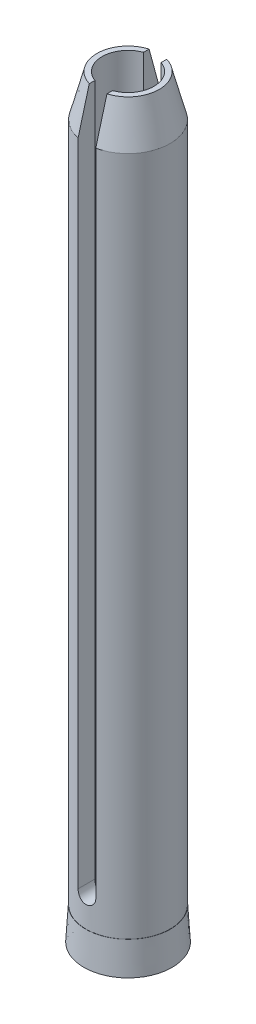
ISO-10303-21;
HEADER;
FILE_DESCRIPTION(('STEP AP214'),'2;1');
FILE_NAME('part.step','',(''),(''),'','','');
FILE_SCHEMA(('AUTOMOTIVE_DESIGN { 1 0 10303 214 1 1 1 1 }'));
ENDSEC;
DATA;
#1=APPLICATION_CONTEXT('core data for automotive mechanical design processes');
#2=APPLICATION_PROTOCOL_DEFINITION('international standard','automotive_design',2000,#1);
#3=PRODUCT_CONTEXT('',#1,'mechanical');
#4=PRODUCT('Part','Part','',(#3));
#5=PRODUCT_RELATED_PRODUCT_CATEGORY('part','',(#4));
#6=PRODUCT_DEFINITION_FORMATION('','',#4);
#7=PRODUCT_DEFINITION_CONTEXT('part definition',#1,'design');
#8=PRODUCT_DEFINITION('design','',#6,#7);
#9=PRODUCT_DEFINITION_SHAPE('','',#8);
#10=(LENGTH_UNIT() NAMED_UNIT(*) SI_UNIT(.MILLI.,.METRE.));
#11=(NAMED_UNIT(*) PLANE_ANGLE_UNIT() SI_UNIT($,.RADIAN.));
#12=(NAMED_UNIT(*) SI_UNIT($,.STERADIAN.) SOLID_ANGLE_UNIT());
#13=UNCERTAINTY_MEASURE_WITH_UNIT(LENGTH_MEASURE(1.E-05),#10,'distance_accuracy_value','');
#14=(GEOMETRIC_REPRESENTATION_CONTEXT(3) GLOBAL_UNCERTAINTY_ASSIGNED_CONTEXT((#13)) GLOBAL_UNIT_ASSIGNED_CONTEXT((#10,
#11,#12)) REPRESENTATION_CONTEXT('',''));
#15=CARTESIAN_POINT('',(0.,0.,0.));
#16=DIRECTION('',(0.,0.,1.));
#17=DIRECTION('',(1.,0.,0.));
#18=AXIS2_PLACEMENT_3D('',#15,#16,#17);
#19=CARTESIAN_POINT('',(0.,140.8,0.));
#20=DIRECTION('',(0.,1.,0.));
#21=DIRECTION('',(0.,0.,1.));
#22=AXIS2_PLACEMENT_3D('',#19,#20,#21);
#23=PLANE('',#22);
#24=DIRECTION('',(0.,0.,1.));
#25=VECTOR('',#24,1.);
#26=CARTESIAN_POINT('',(-1.65,140.8,-8.24));
#27=LINE('',#26,#25);
#28=CARTESIAN_POINT('',(-1.65,140.8,-5.58459636896277));
#29=VERTEX_POINT('',#28);
#30=CARTESIAN_POINT('',(-1.65,140.8,-4.54474696765397));
#31=VERTEX_POINT('',#30);
#32=EDGE_CURVE('E212',#29,#31,#27,.T.);
#33=ORIENTED_EDGE('',*,*,#32,.F.);
#34=CARTESIAN_POINT('',(0.,140.8,0.));
#35=DIRECTION('',(0.,1.,0.));
#36=DIRECTION('',(-1.,0.,0.));
#37=AXIS2_PLACEMENT_3D('',#34,#35,#36);
#38=CIRCLE('',#37,5.82324794287794);
#39=CARTESIAN_POINT('',(-1.65,140.8,5.58459636896277));
#40=VERTEX_POINT('',#39);
#41=EDGE_CURVE('E60',#29,#40,#38,.T.);
#42=ORIENTED_EDGE('',*,*,#41,.T.);
#43=CARTESIAN_POINT('',(-1.65,140.8,4.54474696765397));
#44=VERTEX_POINT('',#43);
#45=EDGE_CURVE('E135',#44,#40,#27,.T.);
#46=ORIENTED_EDGE('',*,*,#45,.F.);
#47=CARTESIAN_POINT('',(0.,140.8,0.));
#48=DIRECTION('',(0.,1.,0.));
#49=DIRECTION('',(0.,0.,1.));
#50=AXIS2_PLACEMENT_3D('',#47,#48,#49);
#51=CIRCLE('',#50,4.835);
#52=EDGE_CURVE('E204',#31,#44,#51,.T.);
#53=ORIENTED_EDGE('',*,*,#52,.F.);
#54=EDGE_LOOP('',(#33,#42,#46,#53));
#55=FACE_BOUND('',#54,.T.);
#56=ADVANCED_FACE('F39',(#55),#23,.T.);
#57=CARTESIAN_POINT('',(0.,140.8,0.));
#58=DIRECTION('',(0.,-1.,0.));
#59=DIRECTION('',(0.,0.,-1.));
#60=AXIS2_PLACEMENT_3D('',#57,#58,#59);
#61=CYLINDRICAL_SURFACE('',#60,7.85);
#62=CARTESIAN_POINT('',(0.,6.,0.));
#63=DIRECTION('',(0.,1.,0.));
#64=DIRECTION('',(0.,0.,1.));
#65=AXIS2_PLACEMENT_3D('',#62,#63,#64);
#66=CIRCLE('',#65,7.85);
#67=CARTESIAN_POINT('',(0.,6.,7.85));
#68=VERTEX_POINT('',#67);
#69=EDGE_CURVE('E218',#68,#68,#66,.T.);
#70=ORIENTED_EDGE('',*,*,#69,.T.);
#71=EDGE_LOOP('',(#70));
#72=FACE_BOUND('',#71,.T.);
#73=CARTESIAN_POINT('',(0.,133.06,0.));
#74=DIRECTION('',(0.,1.,0.));
#75=DIRECTION('',(-1.,0.,0.));
#76=AXIS2_PLACEMENT_3D('',#73,#74,#75);
#77=CIRCLE('',#76,7.85);
#78=CARTESIAN_POINT('',(1.65,133.06,7.67463354173996));
#79=VERTEX_POINT('',#78);
#80=CARTESIAN_POINT('',(1.65,133.06,-7.67463354173996));
#81=VERTEX_POINT('',#80);
#82=EDGE_CURVE('E67',#79,#81,#77,.T.);
#83=ORIENTED_EDGE('',*,*,#82,.F.);
#84=DIRECTION('',(0.,-1.,0.));
#85=VECTOR('',#84,1.);
#86=CARTESIAN_POINT('',(1.65,140.8,7.67463354173996));
#87=LINE('',#86,#85);
#88=CARTESIAN_POINT('',(1.65,11.6214187123484,7.67463354173996));
#89=VERTEX_POINT('',#88);
#90=EDGE_CURVE('E144',#79,#89,#87,.T.);
#91=ORIENTED_EDGE('',*,*,#90,.T.);
#92=CARTESIAN_POINT('',(1.65,11.6214187123484,7.67463354173996));
#93=CARTESIAN_POINT('',(1.65003972735565,11.5755474602447,7.67462256804998));
#94=CARTESIAN_POINT('',(1.64816473167229,11.5296969742745,7.67502837586591));
#95=CARTESIAN_POINT('',(1.64060989678428,11.4383309244032,7.67664780128677));
#96=CARTESIAN_POINT('',(1.63493055826137,11.3928153172264,7.67786131259137));
#97=CARTESIAN_POINT('',(1.61225990352662,11.2574179408737,7.68266695033582));
#98=CARTESIAN_POINT('',(1.58963585647476,11.1684541716994,7.68742439172302));
#99=CARTESIAN_POINT('',(1.53006821836619,10.9956964387333,7.69950013800612));
#100=CARTESIAN_POINT('',(1.49312356804851,10.9119028578997,7.70681863233312));
#101=CARTESIAN_POINT('',(1.40599647770422,10.7516748760457,7.72318794441513));
#102=CARTESIAN_POINT('',(1.35581226198781,10.675241464049,7.73223899449571));
#103=CARTESIAN_POINT('',(1.24280770698675,10.5307528865059,7.75120941406419));
#104=CARTESIAN_POINT('',(1.17982174284139,10.4628286463033,7.76113908681371));
#105=CARTESIAN_POINT('',(1.04335128757635,10.3384208998016,7.78065944728201));
#106=CARTESIAN_POINT('',(0.969865159278708,10.2819391809388,7.79025008184678));
#107=CARTESIAN_POINT('',(0.813598859904362,10.1815057330754,7.80812343851194));
#108=CARTESIAN_POINT('',(0.730735296962562,10.1376811260242,7.81639254223732));
#109=CARTESIAN_POINT('',(0.55862211016667,10.0646292721721,7.83057385648564));
#110=CARTESIAN_POINT('',(0.469373489138078,10.0353997388247,7.8364864361656));
#111=CARTESIAN_POINT('',(0.288387824078499,9.99277837338936,7.84521626552949));
#112=CARTESIAN_POINT('',(0.19670536448066,9.97916381520481,7.84807700319909));
#113=CARTESIAN_POINT('',(0.012313883362104,9.96746238723226,7.85053156427416));
#114=CARTESIAN_POINT('',(-0.0803950520734757,9.96937422503072,7.8501256595942));
#115=CARTESIAN_POINT('',(-0.262660812335773,9.98850530497952,7.84612595019233));
#116=CARTESIAN_POINT('',(-0.352244289385008,10.0054827080864,7.84258251248012));
#117=CARTESIAN_POINT('',(-0.527260787014152,10.0538772444349,7.83276344292941));
#118=CARTESIAN_POINT('',(-0.612693663759819,10.085294877692,7.82648771648159));
#119=CARTESIAN_POINT('',(-0.777658532168961,10.1618934152309,7.81182808746722));
#120=CARTESIAN_POINT('',(-0.857146388956486,10.2071665673403,7.80343012275681));
#121=CARTESIAN_POINT('',(-1.00748272903928,10.310121611721,7.78544919096319));
#122=CARTESIAN_POINT('',(-1.07833037291991,10.3678047081418,7.77586610892523));
#123=CARTESIAN_POINT('',(-1.21080463022692,10.4952505703939,7.75635404299457));
#124=CARTESIAN_POINT('',(-1.27222893794057,10.5652232944036,7.74642194896));
#125=CARTESIAN_POINT('',(-1.38252284484199,10.7145991021547,7.72750105000793));
#126=CARTESIAN_POINT('',(-1.43138904068379,10.79400473378,7.7185125011881));
#127=CARTESIAN_POINT('',(-1.51526584422294,10.9603204937112,7.70248698181739));
#128=CARTESIAN_POINT('',(-1.55023194870393,11.0472536577849,7.69545630084915));
#129=CARTESIAN_POINT('',(-1.60495324669829,11.2258895073466,7.68423180852507));
#130=CARTESIAN_POINT('',(-1.62473083550905,11.3175849569202,7.68003382150699));
#131=CARTESIAN_POINT('',(-1.64110408120381,11.4452593844934,7.67654154504414));
#132=CARTESIAN_POINT('',(-1.64446763666095,11.4804337271921,7.67582120686153));
#133=CARTESIAN_POINT('',(-1.64892799305678,11.5508732547371,7.67486429100913));
#134=CARTESIAN_POINT('',(-1.65002858197185,11.5861381886815,7.67462690493357));
#135=CARTESIAN_POINT('',(-1.65,11.6214187123484,7.67463354173996));
#136=B_SPLINE_CURVE_WITH_KNOTS('',3,(#92,#93,#94,#95,#96,#97,#98,#99,#100,#101,#102,#103,#104,
#105,#106,#107,#108,#109,#110,#111,#112,#113,#114,#115,#116,#117,#118,#119,#120,#121,#122,#123,
#124,#125,#126,#127,#128,#129,#130,#131,#132,#133,#134,#135),.UNSPECIFIED.,.F.,.F.,(4,2,2,2,2,2,
2,2,2,2,2,2,2,2,2,2,2,2,2,2,2,4),(0.,0.137527637235074,0.275037178295358,0.549370921269742,
0.823724959931889,1.09811581366607,1.37631286169738,1.65455333343926,1.93549818303898,
2.21639900441623,2.49324128643293,2.77006052439976,3.04251493873537,3.31497878793815,
3.58929764560211,3.86364313271821,4.14323639410386,4.42290534772218,4.70346262778498,
4.98360543075054,5.0895725174194,5.19536208105572),.UNSPECIFIED.);
#137=CARTESIAN_POINT('',(-1.65,11.6214187123484,7.67463354173996));
#138=VERTEX_POINT('',#137);
#139=EDGE_CURVE('E142',#89,#138,#136,.T.);
#140=ORIENTED_EDGE('',*,*,#139,.T.);
#141=DIRECTION('',(0.,-1.,0.));
#142=VECTOR('',#141,1.);
#143=CARTESIAN_POINT('',(-1.65,140.8,7.67463354173996));
#144=LINE('',#143,#142);
#145=CARTESIAN_POINT('',(-1.65,133.06,7.67463354173996));
#146=VERTEX_POINT('',#145);
#147=EDGE_CURVE('E132',#138,#146,#144,.F.);
#148=ORIENTED_EDGE('',*,*,#147,.T.);
#149=CARTESIAN_POINT('',(-1.65,133.06,-7.67463354173996));
#150=VERTEX_POINT('',#149);
#151=EDGE_CURVE('E119',#150,#146,#77,.T.);
#152=ORIENTED_EDGE('',*,*,#151,.F.);
#153=DIRECTION('',(0.,-1.,0.));
#154=VECTOR('',#153,1.);
#155=CARTESIAN_POINT('',(-1.65,140.8,-7.67463354173996));
#156=LINE('',#155,#154);
#157=CARTESIAN_POINT('',(-1.65,11.6214187123484,-7.67463354173996));
#158=VERTEX_POINT('',#157);
#159=EDGE_CURVE('E143',#150,#158,#156,.T.);
#160=ORIENTED_EDGE('',*,*,#159,.T.);
#161=CARTESIAN_POINT('',(-1.65,11.6214187123484,-7.67463354173996));
#162=CARTESIAN_POINT('',(-1.65003972735565,11.5755474602447,-7.67462256804998));
#163=CARTESIAN_POINT('',(-1.64816473167229,11.5296969742745,-7.67502837586591));
#164=CARTESIAN_POINT('',(-1.64060989678427,11.4383309244032,-7.67664780128677));
#165=CARTESIAN_POINT('',(-1.63493055826137,11.3928153172264,-7.67786131259137));
#166=CARTESIAN_POINT('',(-1.61225990352662,11.2574179408737,-7.68266695033582));
#167=CARTESIAN_POINT('',(-1.58963585647476,11.1684541716994,-7.68742439172302));
#168=CARTESIAN_POINT('',(-1.53006821836618,10.9956964387333,-7.69950013800612));
#169=CARTESIAN_POINT('',(-1.4931235680485,10.9119028578997,-7.70681863233312));
#170=CARTESIAN_POINT('',(-1.40599647770422,10.7516748760457,-7.72318794441513));
#171=CARTESIAN_POINT('',(-1.35581226198781,10.675241464049,-7.73223899449571));
#172=CARTESIAN_POINT('',(-1.24280770698675,10.5307528865059,-7.75120941406419));
#173=CARTESIAN_POINT('',(-1.17982174284139,10.4628286463033,-7.76113908681371));
#174=CARTESIAN_POINT('',(-1.04335128757635,10.3384208998016,-7.78065944728201));
#175=CARTESIAN_POINT('',(-0.969865159278705,10.2819391809388,-7.79025008184678));
#176=CARTESIAN_POINT('',(-0.813598859904359,10.1815057330754,-7.80812343851195));
#177=CARTESIAN_POINT('',(-0.730735296962558,10.1376811260242,-7.81639254223732));
#178=CARTESIAN_POINT('',(-0.558622110166667,10.0646292721721,-7.83057385648564));
#179=CARTESIAN_POINT('',(-0.469373489138074,10.0353997388247,-7.8364864361656));
#180=CARTESIAN_POINT('',(-0.288387824078496,9.99277837338936,-7.84521626552949));
#181=CARTESIAN_POINT('',(-0.196705364480657,9.97916381520481,-7.84807700319909));
#182=CARTESIAN_POINT('',(-0.0123138833621007,9.96746238723226,-7.85053156427416));
#183=CARTESIAN_POINT('',(0.080395052073479,9.96937422503072,-7.8501256595942));
#184=CARTESIAN_POINT('',(0.262660812335776,9.98850530497952,-7.84612595019233));
#185=CARTESIAN_POINT('',(0.352244289385011,10.0054827080864,-7.84258251248012));
#186=CARTESIAN_POINT('',(0.527260787014156,10.0538772444349,-7.83276344292941));
#187=CARTESIAN_POINT('',(0.612693663759822,10.085294877692,-7.82648771648159));
#188=CARTESIAN_POINT('',(0.777658532168964,10.1618934152309,-7.81182808746722));
#189=CARTESIAN_POINT('',(0.857146388956489,10.2071665673403,-7.8034301227568));
#190=CARTESIAN_POINT('',(1.00748272903928,10.310121611721,-7.78544919096319));
#191=CARTESIAN_POINT('',(1.07833037291992,10.3678047081418,-7.77586610892523));
#192=CARTESIAN_POINT('',(1.21080463022693,10.4952505703939,-7.75635404299457));
#193=CARTESIAN_POINT('',(1.27222893794057,10.5652232944036,-7.74642194896));
#194=CARTESIAN_POINT('',(1.38252284484199,10.7145991021547,-7.72750105000793));
#195=CARTESIAN_POINT('',(1.4313890406838,10.79400473378,-7.7185125011881));
#196=CARTESIAN_POINT('',(1.51526584422294,10.9603204937112,-7.70248698181739));
#197=CARTESIAN_POINT('',(1.55023194870394,11.0472536577849,-7.69545630084915));
#198=CARTESIAN_POINT('',(1.60495324669829,11.2258895073466,-7.68423180852507));
#199=CARTESIAN_POINT('',(1.62473083550906,11.3175849569202,-7.68003382150699));
#200=CARTESIAN_POINT('',(1.64110408120382,11.4452593844934,-7.67654154504414));
#201=CARTESIAN_POINT('',(1.64446763666095,11.4804337271921,-7.67582120686153));
#202=CARTESIAN_POINT('',(1.64892799305678,11.5508732547371,-7.67486429100913));
#203=CARTESIAN_POINT('',(1.65002858197185,11.5861381886815,-7.67462690493357));
#204=CARTESIAN_POINT('',(1.65,11.6214187123484,-7.67463354173996));
#205=B_SPLINE_CURVE_WITH_KNOTS('',3,(#161,#162,#163,#164,#165,#166,#167,#168,#169,#170,#171,
#172,#173,#174,#175,#176,#177,#178,#179,#180,#181,#182,#183,#184,#185,#186,#187,#188,#189,#190,
#191,#192,#193,#194,#195,#196,#197,#198,#199,#200,#201,#202,#203,#204),.UNSPECIFIED.,.F.,.F.,(4,
2,2,2,2,2,2,2,2,2,2,2,2,2,2,2,2,2,2,2,2,4),(0.,0.137527637235074,0.275037178295358,
0.549370921269742,0.823724959931887,1.09811581366607,1.37631286169738,1.65455333343926,
1.93549818303898,2.21639900441623,2.49324128643293,2.77006052439976,3.04251493873537,
3.31497878793815,3.58929764560211,3.86364313271821,4.14323639410386,4.42290534772218,
4.70346262778498,4.98360543075054,5.0895725174194,5.19536208105572),.UNSPECIFIED.);
#206=CARTESIAN_POINT('',(1.65,11.6214187123484,-7.67463354173996));
#207=VERTEX_POINT('',#206);
#208=EDGE_CURVE('E146',#158,#207,#205,.T.);
#209=ORIENTED_EDGE('',*,*,#208,.T.);
#210=DIRECTION('',(0.,-1.,0.));
#211=VECTOR('',#210,1.);
#212=CARTESIAN_POINT('',(1.65,140.8,-7.67463354173996));
#213=LINE('',#212,#211);
#214=EDGE_CURVE('E148',#207,#81,#213,.F.);
#215=ORIENTED_EDGE('',*,*,#214,.T.);
#216=EDGE_LOOP('',(#83,#91,#140,#148,#152,#160,#209,#215));
#217=FACE_BOUND('',#216,.T.);
#218=ADVANCED_FACE('F140',(#72,#217),#61,.T.);
#219=DIRECTION('',(0.,0.,1.));
#220=VECTOR('',#219,1.);
#221=CARTESIAN_POINT('',(1.65,140.8,-8.24));
#222=LINE('',#221,#220);
#223=CARTESIAN_POINT('',(1.65,140.8,4.54474696765397));
#224=VERTEX_POINT('',#223);
#225=CARTESIAN_POINT('',(1.65,140.8,5.58459636896277));
#226=VERTEX_POINT('',#225);
#227=EDGE_CURVE('E241',#224,#226,#222,.T.);
#228=ORIENTED_EDGE('',*,*,#227,.T.);
#229=CARTESIAN_POINT('',(1.65,140.8,-5.58459636896277));
#230=VERTEX_POINT('',#229);
#231=EDGE_CURVE('E262',#226,#230,#38,.T.);
#232=ORIENTED_EDGE('',*,*,#231,.T.);
#233=CARTESIAN_POINT('',(1.65,140.8,-4.54474696765397));
#234=VERTEX_POINT('',#233);
#235=EDGE_CURVE('E235',#230,#234,#222,.T.);
#236=ORIENTED_EDGE('',*,*,#235,.T.);
#237=EDGE_CURVE('E213',#224,#234,#51,.T.);
#238=ORIENTED_EDGE('',*,*,#237,.F.);
#239=EDGE_LOOP('',(#228,#232,#236,#238));
#240=FACE_BOUND('',#239,.T.);
#241=ADVANCED_FACE('F261',(#240),#23,.T.);
#242=CARTESIAN_POINT('',(-1.65,140.8,-8.24));
#243=DIRECTION('',(-1.,0.,0.));
#244=DIRECTION('',(0.,0.,1.));
#245=AXIS2_PLACEMENT_3D('',#242,#243,#244);
#246=PLANE('',#245);
#247=CARTESIAN_POINT('',(-1.65,124.710920436451,9.89967960777191));
#248=CARTESIAN_POINT('',(-1.65,126.000890454624,9.55719602121643));
#249=CARTESIAN_POINT('',(-1.65,127.290760364484,9.21433313210806));
#250=CARTESIAN_POINT('',(-1.65,129.870164758972,8.52734396385338));
#251=CARTESIAN_POINT('',(-1.65,131.159699243319,8.18321768365563));
#252=CARTESIAN_POINT('',(-1.65,133.738240660983,7.49321217275478));
#253=CARTESIAN_POINT('',(-1.65,135.027247614382,7.14733301713766));
#254=CARTESIAN_POINT('',(-1.65,137.604542019667,6.45289155679596));
#255=CARTESIAN_POINT('',(-1.65,138.892829470526,6.10432924825152));
#256=CARTESIAN_POINT('',(-1.65,140.929373519212,5.54954287257574));
#257=CARTESIAN_POINT('',(-1.65,141.678030591937,5.34478959869261));
#258=CARTESIAN_POINT('',(-1.65,143.174759315273,4.93316686925999));
#259=CARTESIAN_POINT('',(-1.65,143.922830969238,4.72629742593221));
#260=CARTESIAN_POINT('',(-1.65,145.044299667423,4.41365919974803));
#261=CARTESIAN_POINT('',(-1.65,145.418021532306,4.30905590958383));
#262=CARTESIAN_POINT('',(-1.65,146.165191011619,4.09887660930687));
#263=CARTESIAN_POINT('',(-1.65,146.538638626571,3.9933006010478));
#264=CARTESIAN_POINT('',(-1.65,147.285196037814,3.78093309329493));
#265=CARTESIAN_POINT('',(-1.65,147.658305827848,3.67414157176576));
#266=CARTESIAN_POINT('',(-1.65,148.404066590186,3.45896023379287));
#267=CARTESIAN_POINT('',(-1.65,148.776717559463,3.3505704068619));
#268=CARTESIAN_POINT('',(-1.65,149.149079563549,3.24118978066494));
#269=B_SPLINE_CURVE_WITH_KNOTS('',3,(#247,#248,#249,#250,#251,#252,#253,#254,#255,#256,#257,
#258,#259,#260,#261,#262,#263,#264,#265,#266,#267,#268),.UNSPECIFIED.,.F.,.F.,(4,2,2,2,2,2,2,2,
2,2,4),(0.,4.00398123586134,8.00796580475959,12.0117802852225,16.0156004667873,18.3440534588724,
20.6724930108196,21.8367466438385,23.0009980586304,24.1652706132347,25.3295508106046),.UNSPECIFIED.);
#270=EDGE_CURVE('E122',#146,#40,#269,.T.);
#271=ORIENTED_EDGE('',*,*,#270,.F.);
#272=ORIENTED_EDGE('',*,*,#147,.F.);
#273=DIRECTION('',(0.,0.,1.));
#274=VECTOR('',#273,1.);
#275=CARTESIAN_POINT('',(-1.65,11.6214187123484,-8.24));
#276=LINE('',#275,#274);
#277=CARTESIAN_POINT('',(-1.65,11.6214187123484,4.54474696765397));
#278=VERTEX_POINT('',#277);
#279=EDGE_CURVE('E244',#278,#138,#276,.T.);
#280=ORIENTED_EDGE('',*,*,#279,.F.);
#281=DIRECTION('',(0.,1.,0.));
#282=VECTOR('',#281,1.);
#283=CARTESIAN_POINT('',(-1.65,0.,4.54474696765397));
#284=LINE('',#283,#282);
#285=EDGE_CURVE('E230',#44,#278,#284,.F.);
#286=ORIENTED_EDGE('',*,*,#285,.F.);
#287=ORIENTED_EDGE('',*,*,#45,.T.);
#288=EDGE_LOOP('',(#271,#272,#280,#286,#287));
#289=FACE_BOUND('',#288,.T.);
#290=ADVANCED_FACE('F130',(#289),#246,.F.);
#291=CARTESIAN_POINT('',(1.65,140.8,-8.24));
#292=DIRECTION('',(1.,0.,0.));
#293=DIRECTION('',(0.,1.,0.));
#294=AXIS2_PLACEMENT_3D('',#291,#292,#293);
#295=PLANE('',#294);
#296=CARTESIAN_POINT('',(1.65,149.149079563549,3.24118978066494));
#297=CARTESIAN_POINT('',(1.65,148.91704321661,3.30936470974856));
#298=CARTESIAN_POINT('',(1.65,148.684890286333,3.37714126194989));
#299=CARTESIAN_POINT('',(1.65,148.220386385924,3.51201014914572));
#300=CARTESIAN_POINT('',(1.65,147.98803541633,3.57910248599575));
#301=CARTESIAN_POINT('',(1.65,147.290741078317,3.779521140521));
#302=CARTESIAN_POINT('',(1.65,146.825551458328,3.91199051392478));
#303=CARTESIAN_POINT('',(1.65,145.894707523538,4.17524554046809));
#304=CARTESIAN_POINT('',(1.65,145.429053218699,4.3060312289042));
#305=CARTESIAN_POINT('',(1.65,144.497385930354,4.56631942156806));
#306=CARTESIAN_POINT('',(1.65,144.031372946527,4.69582192464706));
#307=CARTESIAN_POINT('',(1.65,142.781166064569,5.0418122243681));
#308=CARTESIAN_POINT('',(1.65,141.996720697844,5.25739093753071));
#309=CARTESIAN_POINT('',(1.65,140.427303249499,5.68662105477099));
#310=CARTESIAN_POINT('',(1.65,139.642331167583,5.90027245776075));
#311=CARTESIAN_POINT('',(1.65,138.072005553334,6.32618338808872));
#312=CARTESIAN_POINT('',(1.65,137.286652019153,6.5384429086109));
#313=CARTESIAN_POINT('',(1.65,135.715664533236,6.96192175123052));
#314=CARTESIAN_POINT('',(1.65,134.930030581437,7.17314107309306));
#315=CARTESIAN_POINT('',(1.65,132.572691789824,7.80565180516023));
#316=CARTESIAN_POINT('',(1.65,131.000670433171,8.2257634129175));
#317=CARTESIAN_POINT('',(1.65,128.642259796194,8.8544630617739));
#318=CARTESIAN_POINT('',(1.65,127.856065444019,9.06378349167306));
#319=CARTESIAN_POINT('',(1.65,126.283568667467,9.48201690156057));
#320=CARTESIAN_POINT('',(1.65,125.49726624313,9.69092988169593));
#321=CARTESIAN_POINT('',(1.65,124.710920436451,9.89967960777191));
#322=B_SPLINE_CURVE_WITH_KNOTS('',3,(#296,#297,#298,#299,#300,#301,#302,#303,#304,#305,#306,
#307,#308,#309,#310,#311,#312,#313,#314,#315,#316,#317,#318,#319,#320,#321),.UNSPECIFIED.,.F.,
.F.,(4,2,2,2,2,2,2,2,2,2,2,2,4),(0.,0.725532007330697,1.45106204657211,2.90210705102907,
4.35312158625482,5.80413742038593,8.24471904841824,10.6853020539916,13.1258970021702,
15.5664925014658,20.4480577372126,22.8888054246602,25.3295522313057),.UNSPECIFIED.);
#323=EDGE_CURVE('E137',#226,#79,#322,.T.);
#324=ORIENTED_EDGE('',*,*,#323,.F.);
#325=ORIENTED_EDGE('',*,*,#227,.F.);
#326=DIRECTION('',(0.,1.,0.));
#327=VECTOR('',#326,1.);
#328=CARTESIAN_POINT('',(1.65,0.,4.54474696765397));
#329=LINE('',#328,#327);
#330=CARTESIAN_POINT('',(1.65,11.6214187123484,4.54474696765397));
#331=VERTEX_POINT('',#330);
#332=EDGE_CURVE('E221',#331,#224,#329,.T.);
#333=ORIENTED_EDGE('',*,*,#332,.F.);
#334=DIRECTION('',(0.,0.,1.));
#335=VECTOR('',#334,1.);
#336=CARTESIAN_POINT('',(1.65,11.6214187123484,-8.24));
#337=LINE('',#336,#335);
#338=EDGE_CURVE('E136',#331,#89,#337,.T.);
#339=ORIENTED_EDGE('',*,*,#338,.T.);
#340=ORIENTED_EDGE('',*,*,#90,.F.);
#341=EDGE_LOOP('',(#324,#325,#333,#339,#340));
#342=FACE_BOUND('',#341,.T.);
#343=ADVANCED_FACE('F175',(#342),#295,.F.);
#344=CARTESIAN_POINT('',(-1.65,149.149079563549,-3.24118978066494));
#345=CARTESIAN_POINT('',(-1.65,148.91704321661,-3.30936470974856));
#346=CARTESIAN_POINT('',(-1.65,148.684890286333,-3.37714126194989));
#347=CARTESIAN_POINT('',(-1.65,148.220386385924,-3.51201014914572));
#348=CARTESIAN_POINT('',(-1.65,147.98803541633,-3.57910248599575));
#349=CARTESIAN_POINT('',(-1.65,147.290741078317,-3.779521140521));
#350=CARTESIAN_POINT('',(-1.65,146.825551458328,-3.91199051392478));
#351=CARTESIAN_POINT('',(-1.65,145.894707523538,-4.17524554046809));
#352=CARTESIAN_POINT('',(-1.65,145.429053218699,-4.3060312289042));
#353=CARTESIAN_POINT('',(-1.65,144.497385930354,-4.56631942156807));
#354=CARTESIAN_POINT('',(-1.65,144.031372946527,-4.69582192464706));
#355=CARTESIAN_POINT('',(-1.65,142.781166064569,-5.0418122243681));
#356=CARTESIAN_POINT('',(-1.65,141.996720697844,-5.25739093753071));
#357=CARTESIAN_POINT('',(-1.65,140.427303249499,-5.68662105477099));
#358=CARTESIAN_POINT('',(-1.65,139.642331167583,-5.90027245776075));
#359=CARTESIAN_POINT('',(-1.65,138.072005553334,-6.32618338808872));
#360=CARTESIAN_POINT('',(-1.65,137.286652019153,-6.5384429086109));
#361=CARTESIAN_POINT('',(-1.65,135.715664533236,-6.96192175123052));
#362=CARTESIAN_POINT('',(-1.65,134.930030581437,-7.17314107309306));
#363=CARTESIAN_POINT('',(-1.65,132.572691789824,-7.80565180516023));
#364=CARTESIAN_POINT('',(-1.65,131.000670433171,-8.2257634129175));
#365=CARTESIAN_POINT('',(-1.65,128.642259796194,-8.8544630617739));
#366=CARTESIAN_POINT('',(-1.65,127.856065444019,-9.06378349167306));
#367=CARTESIAN_POINT('',(-1.65,126.283568667467,-9.48201690156057));
#368=CARTESIAN_POINT('',(-1.65,125.49726624313,-9.69092988169593));
#369=CARTESIAN_POINT('',(-1.65,124.710920436451,-9.89967960777191));
#370=B_SPLINE_CURVE_WITH_KNOTS('',3,(#344,#345,#346,#347,#348,#349,#350,#351,#352,#353,#354,
#355,#356,#357,#358,#359,#360,#361,#362,#363,#364,#365,#366,#367,#368,#369),.UNSPECIFIED.,.F.,
.F.,(4,2,2,2,2,2,2,2,2,2,2,2,4),(0.,0.725532007330697,1.45106204657211,2.90210705102907,
4.35312158625482,5.80413742038593,8.24471904841824,10.6853020539916,13.1258970021702,
15.5664925014658,20.4480577372126,22.8888054246602,25.3295522313057),.UNSPECIFIED.);
#371=EDGE_CURVE('E123',#29,#150,#370,.T.);
#372=ORIENTED_EDGE('',*,*,#371,.F.);
#373=ORIENTED_EDGE('',*,*,#32,.T.);
#374=DIRECTION('',(0.,1.,0.));
#375=VECTOR('',#374,1.);
#376=CARTESIAN_POINT('',(-1.65,0.,-4.54474696765397));
#377=LINE('',#376,#375);
#378=CARTESIAN_POINT('',(-1.65,11.6214187123484,-4.54474696765397));
#379=VERTEX_POINT('',#378);
#380=EDGE_CURVE('E53',#379,#31,#377,.T.);
#381=ORIENTED_EDGE('',*,*,#380,.F.);
#382=EDGE_CURVE('E243',#158,#379,#276,.T.);
#383=ORIENTED_EDGE('',*,*,#382,.F.);
#384=ORIENTED_EDGE('',*,*,#159,.F.);
#385=EDGE_LOOP('',(#372,#373,#381,#383,#384));
#386=FACE_BOUND('',#385,.T.);
#387=ADVANCED_FACE('F293',(#386),#246,.F.);
#388=CARTESIAN_POINT('',(1.65,124.710920436451,-9.89967960777191));
#389=CARTESIAN_POINT('',(1.65,126.000890454624,-9.55719602121643));
#390=CARTESIAN_POINT('',(1.65,127.290760364484,-9.21433313210806));
#391=CARTESIAN_POINT('',(1.65,129.870164758972,-8.52734396385338));
#392=CARTESIAN_POINT('',(1.65,131.159699243319,-8.18321768365563));
#393=CARTESIAN_POINT('',(1.65,133.738240660983,-7.49321217275478));
#394=CARTESIAN_POINT('',(1.65,135.027247614382,-7.14733301713766));
#395=CARTESIAN_POINT('',(1.65,137.604542019667,-6.45289155679596));
#396=CARTESIAN_POINT('',(1.65,138.892829470526,-6.10432924825152));
#397=CARTESIAN_POINT('',(1.65,140.929373519212,-5.54954287257574));
#398=CARTESIAN_POINT('',(1.65,141.678030591937,-5.34478959869261));
#399=CARTESIAN_POINT('',(1.65,143.174759315273,-4.93316686925999));
#400=CARTESIAN_POINT('',(1.65,143.922830969238,-4.72629742593222));
#401=CARTESIAN_POINT('',(1.65,145.044299667423,-4.41365919974803));
#402=CARTESIAN_POINT('',(1.65,145.418021532306,-4.30905590958383));
#403=CARTESIAN_POINT('',(1.65,146.165191011619,-4.09887660930687));
#404=CARTESIAN_POINT('',(1.65,146.538638626571,-3.99330060104778));
#405=CARTESIAN_POINT('',(1.65,147.285196037814,-3.78093309329492));
#406=CARTESIAN_POINT('',(1.65,147.658305827848,-3.67414157176574));
#407=CARTESIAN_POINT('',(1.65,148.404066590186,-3.45896023379286));
#408=CARTESIAN_POINT('',(1.65,148.776717559463,-3.35057040686189));
#409=CARTESIAN_POINT('',(1.65,149.149079563549,-3.24118978066493));
#410=B_SPLINE_CURVE_WITH_KNOTS('',3,(#388,#389,#390,#391,#392,#393,#394,#395,#396,#397,#398,
#399,#400,#401,#402,#403,#404,#405,#406,#407,#408,#409),.UNSPECIFIED.,.F.,.F.,(4,2,2,2,2,2,2,2,
2,2,4),(0.,4.00398123586134,8.00796580475959,12.0117802852225,16.0156004667873,18.3440534588724,
20.6724930108196,21.8367466438385,23.0009980586305,24.1652706132348,25.3295508106046),.UNSPECIFIED.);
#411=EDGE_CURVE('E11',#81,#230,#410,.T.);
#412=ORIENTED_EDGE('',*,*,#411,.F.);
#413=ORIENTED_EDGE('',*,*,#214,.F.);
#414=CARTESIAN_POINT('',(1.65,11.6214187123484,-4.54474696765397));
#415=VERTEX_POINT('',#414);
#416=EDGE_CURVE('E237',#207,#415,#337,.T.);
#417=ORIENTED_EDGE('',*,*,#416,.T.);
#418=DIRECTION('',(0.,1.,0.));
#419=VECTOR('',#418,1.);
#420=CARTESIAN_POINT('',(1.65,0.,-4.54474696765397));
#421=LINE('',#420,#419);
#422=EDGE_CURVE('E198',#234,#415,#421,.F.);
#423=ORIENTED_EDGE('',*,*,#422,.F.);
#424=ORIENTED_EDGE('',*,*,#235,.F.);
#425=EDGE_LOOP('',(#412,#413,#417,#423,#424));
#426=FACE_BOUND('',#425,.T.);
#427=ADVANCED_FACE('F234',(#426),#295,.F.);
#428=CARTESIAN_POINT('',(0.,0.,0.));
#429=DIRECTION('',(0.,1.,0.));
#430=DIRECTION('',(0.,0.,1.));
#431=AXIS2_PLACEMENT_3D('',#428,#429,#430);
#432=PLANE('',#431);
#433=CARTESIAN_POINT('',(0.,0.,0.));
#434=DIRECTION('',(0.,1.,0.));
#435=DIRECTION('',(0.,0.,1.));
#436=AXIS2_PLACEMENT_3D('',#433,#434,#435);
#437=CIRCLE('',#436,4.835);
#438=CARTESIAN_POINT('',(0.,0.,4.835));
#439=VERTEX_POINT('',#438);
#440=EDGE_CURVE('E216',#439,#439,#437,.T.);
#441=ORIENTED_EDGE('',*,*,#440,.T.);
#442=EDGE_LOOP('',(#441));
#443=FACE_BOUND('',#442,.T.);
#444=CARTESIAN_POINT('',(0.,0.,0.));
#445=DIRECTION('',(0.,-1.,0.));
#446=DIRECTION('',(0.,0.,-1.));
#447=AXIS2_PLACEMENT_3D('',#444,#445,#446);
#448=CIRCLE('',#447,8.24);
#449=CARTESIAN_POINT('',(0.,0.,-8.24));
#450=VERTEX_POINT('',#449);
#451=EDGE_CURVE('E223',#450,#450,#448,.T.);
#452=ORIENTED_EDGE('',*,*,#451,.T.);
#453=EDGE_LOOP('',(#452));
#454=FACE_BOUND('',#453,.T.);
#455=ADVANCED_FACE('F41',(#443,#454),#432,.F.);
#456=CARTESIAN_POINT('',(0.,0.,0.));
#457=DIRECTION('',(0.,-1.,0.));
#458=DIRECTION('',(0.,0.,-1.));
#459=AXIS2_PLACEMENT_3D('',#456,#457,#458);
#460=CONICAL_SURFACE('',#459,8.24,0.0593193124737422);
#461=CARTESIAN_POINT('',(0.,6.,0.));
#462=DIRECTION('',(0.,-1.,0.));
#463=DIRECTION('',(0.,0.,-1.));
#464=AXIS2_PLACEMENT_3D('',#461,#462,#463);
#465=CIRCLE('',#464,7.88366607341526);
#466=CARTESIAN_POINT('',(0.,6.,-7.88366607341526));
#467=VERTEX_POINT('',#466);
#468=EDGE_CURVE('E222',#467,#467,#465,.T.);
#469=ORIENTED_EDGE('',*,*,#468,.T.);
#470=EDGE_LOOP('',(#469));
#471=FACE_BOUND('',#470,.T.);
#472=ORIENTED_EDGE('',*,*,#451,.F.);
#473=EDGE_LOOP('',(#472));
#474=FACE_BOUND('',#473,.T.);
#475=ADVANCED_FACE('F304',(#471,#474),#460,.T.);
#476=CARTESIAN_POINT('',(0.,6.,0.));
#477=DIRECTION('',(0.,1.,0.));
#478=DIRECTION('',(0.,0.,1.));
#479=AXIS2_PLACEMENT_3D('',#476,#477,#478);
#480=PLANE('',#479);
#481=ORIENTED_EDGE('',*,*,#69,.F.);
#482=EDGE_LOOP('',(#481));
#483=FACE_BOUND('',#482,.T.);
#484=ORIENTED_EDGE('',*,*,#468,.F.);
#485=EDGE_LOOP('',(#484));
#486=FACE_BOUND('',#485,.T.);
#487=ADVANCED_FACE('F311',(#483,#486),#480,.T.);
#488=CARTESIAN_POINT('',(0.,0.,0.));
#489=DIRECTION('',(0.,1.,0.));
#490=DIRECTION('',(0.,0.,1.));
#491=AXIS2_PLACEMENT_3D('',#488,#489,#490);
#492=CYLINDRICAL_SURFACE('',#491,4.835);
#493=ORIENTED_EDGE('',*,*,#440,.F.);
#494=EDGE_LOOP('',(#493));
#495=FACE_BOUND('',#494,.T.);
#496=CARTESIAN_POINT('',(1.65,11.6214187123484,-4.54474696765397));
#497=CARTESIAN_POINT('',(1.65003994535319,11.5764629499287,-4.54472833061185));
#498=CARTESIAN_POINT('',(1.64823877991747,11.5315284056596,-4.54538680476284));
#499=CARTESIAN_POINT('',(1.64098655961444,11.4420057241609,-4.54801171684982));
#500=CARTESIAN_POINT('',(1.63553652960981,11.3974174932182,-4.54997778751798));
#501=CARTESIAN_POINT('',(1.61381722654848,11.264938557299,-4.55774817553794));
#502=CARTESIAN_POINT('',(1.59217844198351,11.1779752459566,-4.56542528621849));
#503=CARTESIAN_POINT('',(1.53537230212112,11.0092038743935,-4.58483844549201));
#504=CARTESIAN_POINT('',(1.500213067181,10.9273927540338,-4.5965720573316));
#505=CARTESIAN_POINT('',(1.41744019143947,10.7707564913229,-4.62276628420494));
#506=CARTESIAN_POINT('',(1.36981844856135,10.6959359367503,-4.63722867154662));
#507=CARTESIAN_POINT('',(1.26140186087134,10.5524080572647,-4.66790879652558));
#508=CARTESIAN_POINT('',(1.20018475635835,10.4840294104679,-4.68417168660128));
#509=CARTESIAN_POINT('',(1.06720980199021,10.3582791755014,-4.71624436380092));
#510=CARTESIAN_POINT('',(0.995450036854237,10.3009095917201,-4.73205406796974));
#511=CARTESIAN_POINT('',(0.840975989292439,10.1972758552084,-4.76196739333941));
#512=CARTESIAN_POINT('',(0.758013428254332,10.1513631354245,-4.77601166275852));
#513=CARTESIAN_POINT('',(0.584984167809219,10.0742782001832,-4.80027454168163));
#514=CARTESIAN_POINT('',(0.494919728686814,10.0431013167315,-4.81049436247434));
#515=CARTESIAN_POINT('',(0.313699506393817,9.99750076385465,-4.82563796705658));
#516=CARTESIAN_POINT('',(0.222701211431548,9.98251156443917,-4.83074004948964));
#517=CARTESIAN_POINT('',(0.0393457818993848,9.9679092221599,-4.83570869747546));
#518=CARTESIAN_POINT('',(-0.0530110048787917,9.96829221001807,-4.83557658050986));
#519=CARTESIAN_POINT('',(-0.232420392092925,9.98407294457379,-4.83021062528384));
#520=CARTESIAN_POINT('',(-0.319534785840162,9.99885163508248,-4.8251871335723));
#521=CARTESIAN_POINT('',(-0.489961819489854,10.0419741758517,-4.81087094258783));
#522=CARTESIAN_POINT('',(-0.573274250328107,10.0703187710987,-4.80157800885495));
#523=CARTESIAN_POINT('',(-0.735040527006647,10.1401079057619,-4.77950824353355));
#524=CARTESIAN_POINT('',(-0.813415033524839,10.1817216309024,-4.76668672770583));
#525=CARTESIAN_POINT('',(-0.962246297847648,10.2767269849413,-4.73888673436922));
#526=CARTESIAN_POINT('',(-1.03270080298459,10.3301219520209,-4.72390764593679));
#527=CARTESIAN_POINT('',(-1.16735561136688,10.4502495294196,-4.6924962928145));
#528=CARTESIAN_POINT('',(-1.23107890032385,10.5175083423928,-4.6760287890158));
#529=CARTESIAN_POINT('',(-1.34651261142583,10.6619031446082,-4.64410651128369));
#530=CARTESIAN_POINT('',(-1.39821905810423,10.739042389486,-4.62865207370796));
#531=CARTESIAN_POINT('',(-1.48887665589911,10.9026194686002,-4.60030123532911));
#532=CARTESIAN_POINT('',(-1.52760673995355,10.9891881010821,-4.58745051319308));
#533=CARTESIAN_POINT('',(-1.58973083667504,11.1681245350879,-4.56629770140369));
#534=CARTESIAN_POINT('',(-1.61314907533784,11.2604829212123,-4.55798842982296));
#535=CARTESIAN_POINT('',(-1.63566106801853,11.39835997696,-4.54993268188562));
#536=CARTESIAN_POINT('',(-1.64106900885229,11.442802020217,-4.54798180316532));
#537=CARTESIAN_POINT('',(-1.64825569185516,11.5319614457478,-4.54538077779748));
#538=CARTESIAN_POINT('',(-1.65003885840225,11.5766784254504,-4.54472904543849));
#539=CARTESIAN_POINT('',(-1.65,11.6214187123484,-4.54474696765397));
#540=B_SPLINE_CURVE_WITH_KNOTS('',3,(#496,#497,#498,#499,#500,#501,#502,#503,#504,#505,#506,
#507,#508,#509,#510,#511,#512,#513,#514,#515,#516,#517,#518,#519,#520,#521,#522,#523,#524,#525,
#526,#527,#528,#529,#530,#531,#532,#533,#534,#535,#536,#537,#538,#539),.UNSPECIFIED.,.F.,.F.,(4,
2,2,2,2,2,2,2,2,2,2,2,2,2,2,2,2,2,2,2,2,4),(0.,0.134779818860915,0.269521797761753,
0.537945047904202,0.806207334698438,1.07464445825095,1.35301512124446,1.63143641840013,
1.91756595812982,2.20360479735763,2.47929062736422,2.75490706591609,3.01917180693785,
3.28345106201189,3.55124459632995,3.81911410684665,4.10013764825953,4.38125402724177,
4.66694126922468,4.95217540357987,5.08646926762014,5.22059911470205),.UNSPECIFIED.);
#541=EDGE_CURVE('E191',#415,#379,#540,.T.);
#542=ORIENTED_EDGE('',*,*,#541,.T.);
#543=ORIENTED_EDGE('',*,*,#380,.T.);
#544=ORIENTED_EDGE('',*,*,#52,.T.);
#545=ORIENTED_EDGE('',*,*,#285,.T.);
#546=CARTESIAN_POINT('',(-1.65,11.6214187123484,4.54474696765397));
#547=CARTESIAN_POINT('',(-1.65003994535319,11.5764629499287,4.54472833061185));
#548=CARTESIAN_POINT('',(-1.64823877991747,11.5315284056596,4.54538680476284));
#549=CARTESIAN_POINT('',(-1.64098655961444,11.4420057241609,4.54801171684982));
#550=CARTESIAN_POINT('',(-1.63553652960981,11.3974174932182,4.54997778751798));
#551=CARTESIAN_POINT('',(-1.61381722654848,11.264938557299,4.55774817553795));
#552=CARTESIAN_POINT('',(-1.59217844198351,11.1779752459566,4.56542528621849));
#553=CARTESIAN_POINT('',(-1.53537230212112,11.0092038743935,4.58483844549201));
#554=CARTESIAN_POINT('',(-1.50021306718099,10.9273927540338,4.5965720573316));
#555=CARTESIAN_POINT('',(-1.41744019143947,10.7707564913229,4.62276628420494));
#556=CARTESIAN_POINT('',(-1.36981844856134,10.6959359367503,4.63722867154662));
#557=CARTESIAN_POINT('',(-1.26140186087134,10.5524080572647,4.66790879652558));
#558=CARTESIAN_POINT('',(-1.20018475635834,10.4840294104679,4.68417168660128));
#559=CARTESIAN_POINT('',(-1.06720980199021,10.3582791755014,4.71624436380092));
#560=CARTESIAN_POINT('',(-0.995450036854233,10.3009095917201,4.73205406796974));
#561=CARTESIAN_POINT('',(-0.840975989292435,10.1972758552084,4.76196739333941));
#562=CARTESIAN_POINT('',(-0.758013428254328,10.1513631354245,4.77601166275852));
#563=CARTESIAN_POINT('',(-0.584984167809215,10.0742782001832,4.80027454168163));
#564=CARTESIAN_POINT('',(-0.49491972868681,10.0431013167315,4.81049436247434));
#565=CARTESIAN_POINT('',(-0.313699506393814,9.99750076385464,4.82563796705658));
#566=CARTESIAN_POINT('',(-0.222701211431545,9.98251156443917,4.83074004948964));
#567=CARTESIAN_POINT('',(-0.0393457818993816,9.9679092221599,4.83570869747546));
#568=CARTESIAN_POINT('',(0.0530110048787951,9.96829221001807,4.83557658050986));
#569=CARTESIAN_POINT('',(0.232420392092928,9.98407294457379,4.83021062528384));
#570=CARTESIAN_POINT('',(0.319534785840166,9.99885163508248,4.8251871335723));
#571=CARTESIAN_POINT('',(0.489961819489858,10.0419741758517,4.81087094258783));
#572=CARTESIAN_POINT('',(0.573274250328111,10.0703187710987,4.80157800885495));
#573=CARTESIAN_POINT('',(0.735040527006651,10.1401079057619,4.77950824353355));
#574=CARTESIAN_POINT('',(0.813415033524842,10.1817216309024,4.76668672770583));
#575=CARTESIAN_POINT('',(0.962246297847651,10.2767269849413,4.73888673436922));
#576=CARTESIAN_POINT('',(1.03270080298459,10.3301219520209,4.72390764593679));
#577=CARTESIAN_POINT('',(1.16735561136688,10.4502495294196,4.6924962928145));
#578=CARTESIAN_POINT('',(1.23107890032385,10.5175083423928,4.6760287890158));
#579=CARTESIAN_POINT('',(1.34651261142584,10.6619031446082,4.64410651128369));
#580=CARTESIAN_POINT('',(1.39821905810423,10.739042389486,4.62865207370796));
#581=CARTESIAN_POINT('',(1.48887665589912,10.9026194686002,4.6003012353291));
#582=CARTESIAN_POINT('',(1.52760673995355,10.9891881010821,4.58745051319308));
#583=CARTESIAN_POINT('',(1.58973083667505,11.1681245350879,4.56629770140369));
#584=CARTESIAN_POINT('',(1.61314907533784,11.2604829212123,4.55798842982296));
#585=CARTESIAN_POINT('',(1.63566106801854,11.39835997696,4.54993268188562));
#586=CARTESIAN_POINT('',(1.64106900885229,11.442802020217,4.54798180316532));
#587=CARTESIAN_POINT('',(1.64825569185516,11.5319614457478,4.54538077779748));
#588=CARTESIAN_POINT('',(1.65003885840226,11.5766784254504,4.54472904543849));
#589=CARTESIAN_POINT('',(1.65,11.6214187123484,4.54474696765397));
#590=B_SPLINE_CURVE_WITH_KNOTS('',3,(#546,#547,#548,#549,#550,#551,#552,#553,#554,#555,#556,
#557,#558,#559,#560,#561,#562,#563,#564,#565,#566,#567,#568,#569,#570,#571,#572,#573,#574,#575,
#576,#577,#578,#579,#580,#581,#582,#583,#584,#585,#586,#587,#588,#589),.UNSPECIFIED.,.F.,.F.,(4,
2,2,2,2,2,2,2,2,2,2,2,2,2,2,2,2,2,2,2,2,4),(0.,0.134779818860916,0.269521797761753,
0.537945047904202,0.806207334698438,1.07464445825095,1.35301512124446,1.63143641840012,
1.91756595812982,2.20360479735763,2.47929062736422,2.75490706591609,3.01917180693785,
3.28345106201189,3.55124459632995,3.81911410684665,4.10013764825953,4.38125402724177,
4.66694126922469,4.95217540357987,5.08646926762014,5.22059911470205),.UNSPECIFIED.);
#591=EDGE_CURVE('E182',#278,#331,#590,.T.);
#592=ORIENTED_EDGE('',*,*,#591,.T.);
#593=ORIENTED_EDGE('',*,*,#332,.T.);
#594=ORIENTED_EDGE('',*,*,#237,.T.);
#595=ORIENTED_EDGE('',*,*,#422,.T.);
#596=EDGE_LOOP('',(#542,#543,#544,#545,#592,#593,#594,#595));
#597=FACE_BOUND('',#596,.T.);
#598=ADVANCED_FACE('F173',(#495,#597),#492,.F.);
#599=CARTESIAN_POINT('',(0.,11.6200006093987,-8.24));
#600=DIRECTION('',(0.,0.,1.));
#601=DIRECTION('',(1.,0.,0.));
#602=AXIS2_PLACEMENT_3D('',#599,#600,#601);
#603=CYLINDRICAL_SURFACE('',#602,1.65000060939867);
#604=ORIENTED_EDGE('',*,*,#338,.F.);
#605=ORIENTED_EDGE('',*,*,#591,.F.);
#606=ORIENTED_EDGE('',*,*,#279,.T.);
#607=ORIENTED_EDGE('',*,*,#139,.F.);
#608=EDGE_LOOP('',(#604,#605,#606,#607));
#609=FACE_BOUND('',#608,.T.);
#610=ADVANCED_FACE('F168',(#609),#603,.F.);
#611=ORIENTED_EDGE('',*,*,#382,.T.);
#612=ORIENTED_EDGE('',*,*,#541,.F.);
#613=ORIENTED_EDGE('',*,*,#416,.F.);
#614=ORIENTED_EDGE('',*,*,#208,.F.);
#615=EDGE_LOOP('',(#611,#612,#613,#614));
#616=FACE_BOUND('',#615,.T.);
#617=ADVANCED_FACE('F172',(#616),#603,.F.);
#618=CARTESIAN_POINT('',(0.,140.8,0.));
#619=DIRECTION('',(0.,-1.,0.));
#620=DIRECTION('',(1.,0.,0.));
#621=AXIS2_PLACEMENT_3D('',#618,#619,#620);
#622=CONICAL_SURFACE('',#621,5.82324794287794,0.256104132086352);
#623=ORIENTED_EDGE('',*,*,#323,.T.);
#624=ORIENTED_EDGE('',*,*,#82,.T.);
#625=ORIENTED_EDGE('',*,*,#411,.T.);
#626=ORIENTED_EDGE('',*,*,#231,.F.);
#627=EDGE_LOOP('',(#623,#624,#625,#626));
#628=FACE_BOUND('',#627,.T.);
#629=ADVANCED_FACE('F276',(#628),#622,.T.);
#630=ORIENTED_EDGE('',*,*,#270,.T.);
#631=ORIENTED_EDGE('',*,*,#41,.F.);
#632=ORIENTED_EDGE('',*,*,#371,.T.);
#633=ORIENTED_EDGE('',*,*,#151,.T.);
#634=EDGE_LOOP('',(#630,#631,#632,#633));
#635=FACE_BOUND('',#634,.T.);
#636=ADVANCED_FACE('F121',(#635),#622,.T.);
#637=CLOSED_SHELL('',(#56,#218,#241,#290,#343,#387,#427,#455,#475,#487,#598,#610,#617,#629,#636));
#638=MANIFOLD_SOLID_BREP('B2',#637);
#639=ADVANCED_BREP_SHAPE_REPRESENTATION('',(#18,#638),#14);
#640=SHAPE_DEFINITION_REPRESENTATION(#9,#639);
ENDSEC;
END-ISO-10303-21;
